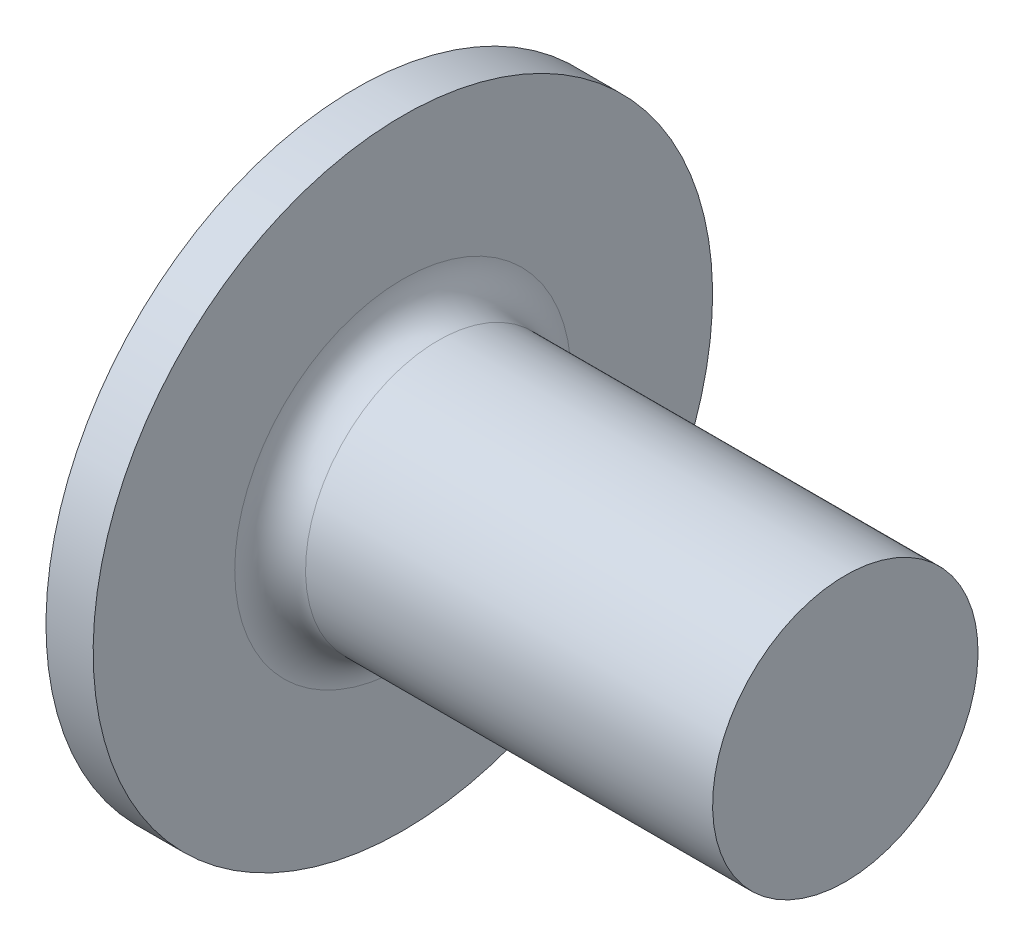
ISO-10303-21;
HEADER;
FILE_DESCRIPTION(('STEP AP214'),'2;1');
FILE_NAME('part.step','',(''),(''),'','','');
FILE_SCHEMA(('AUTOMOTIVE_DESIGN { 1 0 10303 214 1 1 1 1 }'));
ENDSEC;
DATA;
#1=APPLICATION_CONTEXT('core data for automotive mechanical design processes');
#2=APPLICATION_PROTOCOL_DEFINITION('international standard','automotive_design',2000,#1);
#3=PRODUCT_CONTEXT('',#1,'mechanical');
#4=PRODUCT('Part','Part','',(#3));
#5=PRODUCT_RELATED_PRODUCT_CATEGORY('part','',(#4));
#6=PRODUCT_DEFINITION_FORMATION('','',#4);
#7=PRODUCT_DEFINITION_CONTEXT('part definition',#1,'design');
#8=PRODUCT_DEFINITION('design','',#6,#7);
#9=PRODUCT_DEFINITION_SHAPE('','',#8);
#10=(LENGTH_UNIT() NAMED_UNIT(*) SI_UNIT(.MILLI.,.METRE.));
#11=(NAMED_UNIT(*) PLANE_ANGLE_UNIT() SI_UNIT($,.RADIAN.));
#12=(NAMED_UNIT(*) SI_UNIT($,.STERADIAN.) SOLID_ANGLE_UNIT());
#13=UNCERTAINTY_MEASURE_WITH_UNIT(LENGTH_MEASURE(1.E-05),#10,'distance_accuracy_value','');
#14=(GEOMETRIC_REPRESENTATION_CONTEXT(3) GLOBAL_UNCERTAINTY_ASSIGNED_CONTEXT((#13)) GLOBAL_UNIT_ASSIGNED_CONTEXT((#10,
#11,#12)) REPRESENTATION_CONTEXT('',''));
#15=CARTESIAN_POINT('',(0.,0.,0.));
#16=DIRECTION('',(0.,0.,1.));
#17=DIRECTION('',(1.,0.,0.));
#18=AXIS2_PLACEMENT_3D('',#15,#16,#17);
#19=CARTESIAN_POINT('',(-0.800000000000023,0.,0.));
#20=DIRECTION('',(1.,0.,0.));
#21=DIRECTION('',(0.,1.00000000000002,0.));
#22=AXIS2_PLACEMENT_3D('',#19,#20,#21);
#23=PLANE('',#22);
#24=CARTESIAN_POINT('',(-0.800000000000023,0.,0.));
#25=DIRECTION('',(-1.,0.,0.));
#26=DIRECTION('',(0.,-1.00000000000002,0.));
#27=AXIS2_PLACEMENT_3D('',#24,#25,#26);
#28=CIRCLE('',#27,3.0381197846483);
#29=CARTESIAN_POINT('',(-0.800000000000023,-3.03811978464835,0.));
#30=VERTEX_POINT('',#29);
#31=EDGE_CURVE('E212',#30,#30,#28,.T.);
#32=ORIENTED_EDGE('',*,*,#31,.T.);
#33=EDGE_LOOP('',(#32));
#34=FACE_BOUND('',#33,.T.);
#35=CARTESIAN_POINT('',(-0.800000000000023,0.824460158150964,0.476002294246936));
#36=DIRECTION('',(-1.,0.,0.));
#37=DIRECTION('',(0.,0.,-1.00000000000002));
#38=AXIS2_PLACEMENT_3D('',#35,#36,#37);
#39=CIRCLE('',#38,0.317004588484645);
#40=CARTESIAN_POINT('',(-0.800000000000023,0.744268952338256,0.169308180135719));
#41=VERTEX_POINT('',#40);
#42=CARTESIAN_POINT('',(-0.800000000000023,0.518759661231272,0.559901729910717));
#43=VERTEX_POINT('',#42);
#44=EDGE_CURVE('E51',#41,#43,#39,.T.);
#45=ORIENTED_EDGE('',*,*,#44,.T.);
#46=CARTESIAN_POINT('',(-0.800000000000023,0.350000000003403,0.606217782650686));
#47=DIRECTION('',(1.,0.,0.));
#48=DIRECTION('',(0.,0.,-1.00000000000002));
#49=AXIS2_PLACEMENT_3D('',#46,#47,#48);
#50=CIRCLE('',#49,0.174999999999998);
#51=CARTESIAN_POINT('',(-0.800000000000023,0.225509291109205,0.729209910036888));
#52=VERTEX_POINT('',#51);
#53=EDGE_CURVE('E159',#43,#52,#50,.T.);
#54=ORIENTED_EDGE('',*,*,#53,.T.);
#55=CARTESIAN_POINT('',(-0.800000000000023,5.77315972805081E-12,0.95200458848832));
#56=DIRECTION('',(-1.,0.,0.));
#57=DIRECTION('',(0.,0.,-1.00000000000002));
#58=AXIS2_PLACEMENT_3D('',#55,#56,#57);
#59=CIRCLE('',#58,0.317004588484644);
#60=CARTESIAN_POINT('',(-0.800000000000023,-0.225509291100101,0.72920991003822));
#61=VERTEX_POINT('',#60);
#62=EDGE_CURVE('E162',#52,#61,#59,.T.);
#63=ORIENTED_EDGE('',*,*,#62,.T.);
#64=CARTESIAN_POINT('',(-0.800000000000023,-0.349999999997963,0.606217782651131));
#65=DIRECTION('',(1.,0.,0.));
#66=DIRECTION('',(0.,0.,-1.00000000000002));
#67=AXIS2_PLACEMENT_3D('',#64,#65,#66);
#68=CIRCLE('',#67,0.175000000000001);
#69=CARTESIAN_POINT('',(-0.800000000000023,-0.518759661226609,0.55990172990894));
#70=VERTEX_POINT('',#69);
#71=EDGE_CURVE('E165',#61,#70,#68,.T.);
#72=ORIENTED_EDGE('',*,*,#71,.T.);
#73=CARTESIAN_POINT('',(-0.800000000000023,-0.824460158142082,0.476002294245381));
#74=DIRECTION('',(-1.,0.,0.));
#75=DIRECTION('',(0.,0.,-1.00000000000002));
#76=AXIS2_PLACEMENT_3D('',#73,#74,#75);
#77=CIRCLE('',#76,0.317004588484636);
#78=CARTESIAN_POINT('',(-0.800000000000023,-0.744268952330596,0.169308180134164));
#79=VERTEX_POINT('',#78);
#80=EDGE_CURVE('E168',#70,#79,#77,.T.);
#81=ORIENTED_EDGE('',*,*,#80,.T.);
#82=CARTESIAN_POINT('',(-0.800000000000023,-0.699999999996925,3.77475828372553E-12));
#83=DIRECTION('',(1.,0.,0.));
#84=DIRECTION('',(0.,0.,-1.00000000000002));
#85=AXIS2_PLACEMENT_3D('',#82,#83,#84);
#86=CIRCLE('',#85,0.175000000000001);
#87=CARTESIAN_POINT('',(-0.800000000000023,-0.744268952333593,-0.169308180127059));
#88=VERTEX_POINT('',#87);
#89=EDGE_CURVE('E171',#79,#88,#86,.T.);
#90=ORIENTED_EDGE('',*,*,#89,.T.);
#91=CARTESIAN_POINT('',(-0.800000000000023,-0.824460158147744,-0.476002294240718));
#92=DIRECTION('',(-1.,0.,0.));
#93=DIRECTION('',(0.,0.,-1.00000000000002));
#94=AXIS2_PLACEMENT_3D('',#91,#92,#93);
#95=CIRCLE('',#94,0.317004588484645);
#96=CARTESIAN_POINT('',(-0.800000000000023,-0.518759661227275,-0.559901729900725));
#97=VERTEX_POINT('',#96);
#98=EDGE_CURVE('E174',#88,#97,#95,.T.);
#99=ORIENTED_EDGE('',*,*,#98,.T.);
#100=CARTESIAN_POINT('',(-0.800000000000023,-0.34999999999763,-0.606217782645357));
#101=DIRECTION('',(1.,0.,0.));
#102=DIRECTION('',(0.,0.,-1.00000000000002));
#103=AXIS2_PLACEMENT_3D('',#100,#101,#102);
#104=CIRCLE('',#103,0.174999999999999);
#105=CARTESIAN_POINT('',(-0.800000000000023,-0.225509291100656,-0.729209910028894));
#106=VERTEX_POINT('',#105);
#107=EDGE_CURVE('E177',#97,#106,#104,.T.);
#108=ORIENTED_EDGE('',*,*,#107,.T.);
#109=CARTESIAN_POINT('',(-0.800000000000023,5.77315972805081E-12,-0.952004588477884));
#110=DIRECTION('',(-1.,0.,0.));
#111=DIRECTION('',(0.,0.,-1.00000000000002));
#112=AXIS2_PLACEMENT_3D('',#109,#110,#111);
#113=CIRCLE('',#112,0.317004588484644);
#114=CARTESIAN_POINT('',(-0.800000000000023,0.225509291108761,-0.729209910032003));
#115=VERTEX_POINT('',#114);
#116=EDGE_CURVE('E180',#106,#115,#113,.T.);
#117=ORIENTED_EDGE('',*,*,#116,.T.);
#118=CARTESIAN_POINT('',(-0.800000000000023,0.350000000003514,-0.606217782645357));
#119=DIRECTION('',(1.,0.,0.));
#120=DIRECTION('',(0.,0.,-1.00000000000002));
#121=AXIS2_PLACEMENT_3D('',#118,#119,#120);
#122=CIRCLE('',#121,0.175);
#123=CARTESIAN_POINT('',(-0.800000000000023,0.518759661232715,-0.559901729900059));
#124=VERTEX_POINT('',#123);
#125=EDGE_CURVE('E183',#115,#124,#122,.T.);
#126=ORIENTED_EDGE('',*,*,#125,.T.);
#127=CARTESIAN_POINT('',(-0.800000000000023,0.824460158149742,-0.476002294238054));
#128=DIRECTION('',(-1.,0.,0.));
#129=DIRECTION('',(0.,0.,-1.00000000000002));
#130=AXIS2_PLACEMENT_3D('',#127,#128,#129);
#131=CIRCLE('',#130,0.317004588484644);
#132=CARTESIAN_POINT('',(-0.800000000000023,0.744268952334037,-0.169308180130834));
#133=VERTEX_POINT('',#132);
#134=EDGE_CURVE('E149',#124,#133,#131,.T.);
#135=ORIENTED_EDGE('',*,*,#134,.T.);
#136=CARTESIAN_POINT('',(-0.800000000000023,0.700000000002143,3.77475828372553E-12));
#137=DIRECTION('',(1.,0.,0.));
#138=DIRECTION('',(0.,0.,-1.00000000000002));
#139=AXIS2_PLACEMENT_3D('',#136,#137,#138);
#140=CIRCLE('',#139,0.175);
#141=EDGE_CURVE('E186',#133,#41,#140,.T.);
#142=ORIENTED_EDGE('',*,*,#141,.T.);
#143=EDGE_LOOP('',(#45,#54,#63,#72,#81,#90,#99,#108,#117,#126,#135,#142));
#144=FACE_BOUND('',#143,.T.);
#145=ADVANCED_FACE('F36',(#34,#144),#23,.F.);
#146=CARTESIAN_POINT('',(0.,3.5000000000025,1.99840144432528E-12));
#147=DIRECTION('',(-1.,0.,0.));
#148=DIRECTION('',(0.,-1.00000000000002,0.));
#149=AXIS2_PLACEMENT_3D('',#146,#147,#148);
#150=PLANE('',#149);
#151=CARTESIAN_POINT('',(0.,0.,0.));
#152=DIRECTION('',(-1.,0.,0.));
#153=DIRECTION('',(0.,-1.00000000000002,0.));
#154=AXIS2_PLACEMENT_3D('',#151,#152,#153);
#155=CIRCLE('',#154,1.9);
#156=CARTESIAN_POINT('',(0.,-1.90000000000003,0.));
#157=VERTEX_POINT('',#156);
#158=EDGE_CURVE('E44',#157,#157,#155,.T.);
#159=ORIENTED_EDGE('',*,*,#158,.T.);
#160=EDGE_LOOP('',(#159));
#161=FACE_BOUND('',#160,.T.);
#162=CARTESIAN_POINT('',(0.,0.,0.));
#163=DIRECTION('',(-1.,0.,0.));
#164=DIRECTION('',(0.,-1.00000000000002,0.));
#165=AXIS2_PLACEMENT_3D('',#162,#163,#164);
#166=CIRCLE('',#165,3.5);
#167=CARTESIAN_POINT('',(0.,-3.50000000000005,0.));
#168=VERTEX_POINT('',#167);
#169=EDGE_CURVE('E218',#168,#168,#166,.T.);
#170=ORIENTED_EDGE('',*,*,#169,.F.);
#171=EDGE_LOOP('',(#170));
#172=FACE_BOUND('',#171,.T.);
#173=ADVANCED_FACE('F223',(#161,#172),#150,.F.);
#174=CARTESIAN_POINT('',(-0.800000000000023,0.,0.));
#175=DIRECTION('',(-1.,0.,0.));
#176=DIRECTION('',(0.,-1.00000000000002,0.));
#177=AXIS2_PLACEMENT_3D('',#174,#175,#176);
#178=CYLINDRICAL_SURFACE('',#177,3.5);
#179=CARTESIAN_POINT('',(-0.53333333333333,0.,0.));
#180=DIRECTION('',(-1.,0.,0.));
#181=DIRECTION('',(0.,-1.00000000000002,0.));
#182=AXIS2_PLACEMENT_3D('',#179,#180,#181);
#183=CIRCLE('',#182,3.5);
#184=CARTESIAN_POINT('',(-0.53333333333333,-3.50000000000005,0.));
#185=VERTEX_POINT('',#184);
#186=EDGE_CURVE('E215',#185,#185,#183,.T.);
#187=ORIENTED_EDGE('',*,*,#186,.F.);
#188=EDGE_LOOP('',(#187));
#189=FACE_BOUND('',#188,.T.);
#190=ORIENTED_EDGE('',*,*,#169,.T.);
#191=EDGE_LOOP('',(#190));
#192=FACE_BOUND('',#191,.T.);
#193=ADVANCED_FACE('F240',(#189,#192),#178,.T.);
#194=CARTESIAN_POINT('',(-0.53333333333333,0.,0.));
#195=DIRECTION('',(1.,0.,0.));
#196=DIRECTION('',(0.,1.00000000000002,0.));
#197=AXIS2_PLACEMENT_3D('',#194,#195,#196);
#198=CONICAL_SURFACE('',#197,3.5,1.0471975511966);
#199=ORIENTED_EDGE('',*,*,#31,.F.);
#200=EDGE_LOOP('',(#199));
#201=FACE_BOUND('',#200,.T.);
#202=ORIENTED_EDGE('',*,*,#186,.T.);
#203=EDGE_LOOP('',(#202));
#204=FACE_BOUND('',#203,.T.);
#205=ADVANCED_FACE('F246',(#201,#204),#198,.T.);
#206=CARTESIAN_POINT('',(5.,1.50000000000072,4.66293670342566E-12));
#207=DIRECTION('',(-1.,0.,0.));
#208=DIRECTION('',(0.,-1.00000000000002,0.));
#209=AXIS2_PLACEMENT_3D('',#206,#207,#208);
#210=PLANE('',#209);
#211=CARTESIAN_POINT('',(5.,0.,0.));
#212=DIRECTION('',(-1.,0.,0.));
#213=DIRECTION('',(0.,-1.00000000000002,0.));
#214=AXIS2_PLACEMENT_3D('',#211,#212,#213);
#215=CIRCLE('',#214,1.5);
#216=CARTESIAN_POINT('',(5.,-1.50000000000002,0.));
#217=VERTEX_POINT('',#216);
#218=EDGE_CURVE('E209',#217,#217,#215,.T.);
#219=ORIENTED_EDGE('',*,*,#218,.F.);
#220=EDGE_LOOP('',(#219));
#221=FACE_BOUND('',#220,.T.);
#222=ADVANCED_FACE('F244',(#221),#210,.F.);
#223=CARTESIAN_POINT('',(-0.800000000000023,0.,0.));
#224=DIRECTION('',(-1.,0.,0.));
#225=DIRECTION('',(0.,-1.00000000000002,0.));
#226=AXIS2_PLACEMENT_3D('',#223,#224,#225);
#227=CYLINDRICAL_SURFACE('',#226,1.5);
#228=CARTESIAN_POINT('',(0.400000000000011,0.,0.));
#229=DIRECTION('',(-1.,0.,0.));
#230=DIRECTION('',(0.,-1.00000000000002,0.));
#231=AXIS2_PLACEMENT_3D('',#228,#229,#230);
#232=CIRCLE('',#231,1.5);
#233=CARTESIAN_POINT('',(0.400000000000011,-1.50000000000002,0.));
#234=VERTEX_POINT('',#233);
#235=EDGE_CURVE('E11',#234,#234,#232,.F.);
#236=ORIENTED_EDGE('',*,*,#235,.T.);
#237=EDGE_LOOP('',(#236));
#238=FACE_BOUND('',#237,.T.);
#239=ORIENTED_EDGE('',*,*,#218,.T.);
#240=EDGE_LOOP('',(#239));
#241=FACE_BOUND('',#240,.T.);
#242=ADVANCED_FACE('F270',(#238,#241),#227,.T.);
#243=CARTESIAN_POINT('',(-0.0499999999999945,0.824460158150964,0.476002294246936));
#244=DIRECTION('',(-1.,0.,0.));
#245=DIRECTION('',(0.,0.,1.00000000000002));
#246=AXIS2_PLACEMENT_3D('',#243,#244,#245);
#247=CYLINDRICAL_SURFACE('',#246,0.317004588484645);
#248=ORIENTED_EDGE('',*,*,#44,.F.);
#249=DIRECTION('',(-1.,0.,0.));
#250=VECTOR('',#249,1.);
#251=CARTESIAN_POINT('',(-0.0499999999999945,0.744268952338256,0.169308180135719));
#252=LINE('',#251,#250);
#253=CARTESIAN_POINT('',(-0.0499999999999945,0.744268952338256,0.169308180135719));
#254=VERTEX_POINT('',#253);
#255=EDGE_CURVE('E154',#254,#41,#252,.T.);
#256=ORIENTED_EDGE('',*,*,#255,.F.);
#257=CARTESIAN_POINT('',(-0.0499999999999945,0.824460158150964,0.476002294246936));
#258=DIRECTION('',(-1.,0.,0.));
#259=DIRECTION('',(0.,0.,-1.00000000000002));
#260=AXIS2_PLACEMENT_3D('',#257,#258,#259);
#261=CIRCLE('',#260,0.317004588484645);
#262=CARTESIAN_POINT('',(-0.0499999999999945,0.518759661231272,0.559901729910717));
#263=VERTEX_POINT('',#262);
#264=EDGE_CURVE('E189',#254,#263,#261,.T.);
#265=ORIENTED_EDGE('',*,*,#264,.T.);
#266=DIRECTION('',(-1.,0.,0.));
#267=VECTOR('',#266,1.);
#268=CARTESIAN_POINT('',(-0.0499999999999945,0.518759661231272,0.559901729910717));
#269=LINE('',#268,#267);
#270=EDGE_CURVE('E207',#263,#43,#269,.T.);
#271=ORIENTED_EDGE('',*,*,#270,.T.);
#272=EDGE_LOOP('',(#248,#256,#265,#271));
#273=FACE_BOUND('',#272,.T.);
#274=ADVANCED_FACE('F277',(#273),#247,.T.);
#275=CARTESIAN_POINT('',(-0.0499999999999945,0.350000000003403,0.606217782650686));
#276=DIRECTION('',(-1.,0.,0.));
#277=DIRECTION('',(0.,0.,1.00000000000002));
#278=AXIS2_PLACEMENT_3D('',#275,#276,#277);
#279=CYLINDRICAL_SURFACE('',#278,0.174999999999998);
#280=ORIENTED_EDGE('',*,*,#53,.F.);
#281=ORIENTED_EDGE('',*,*,#270,.F.);
#282=CARTESIAN_POINT('',(-0.0499999999999945,0.350000000003403,0.606217782650686));
#283=DIRECTION('',(1.,0.,0.));
#284=DIRECTION('',(0.,0.,-1.00000000000002));
#285=AXIS2_PLACEMENT_3D('',#282,#283,#284);
#286=CIRCLE('',#285,0.174999999999998);
#287=CARTESIAN_POINT('',(-0.0499999999999945,0.225509291109205,0.729209910036888));
#288=VERTEX_POINT('',#287);
#289=EDGE_CURVE('E108',#263,#288,#286,.T.);
#290=ORIENTED_EDGE('',*,*,#289,.T.);
#291=DIRECTION('',(-1.,0.,0.));
#292=VECTOR('',#291,1.);
#293=CARTESIAN_POINT('',(-0.0499999999999945,0.225509291109205,0.729209910036888));
#294=LINE('',#293,#292);
#295=EDGE_CURVE('E205',#288,#52,#294,.T.);
#296=ORIENTED_EDGE('',*,*,#295,.T.);
#297=EDGE_LOOP('',(#280,#281,#290,#296));
#298=FACE_BOUND('',#297,.T.);
#299=ADVANCED_FACE('F284',(#298),#279,.F.);
#300=CARTESIAN_POINT('',(-0.0499999999999945,5.77315972805081E-12,0.95200458848832));
#301=DIRECTION('',(-1.,0.,0.));
#302=DIRECTION('',(0.,0.,1.00000000000002));
#303=AXIS2_PLACEMENT_3D('',#300,#301,#302);
#304=CYLINDRICAL_SURFACE('',#303,0.317004588484644);
#305=ORIENTED_EDGE('',*,*,#62,.F.);
#306=ORIENTED_EDGE('',*,*,#295,.F.);
#307=CARTESIAN_POINT('',(-0.0499999999999945,5.77315972805081E-12,0.95200458848832));
#308=DIRECTION('',(-1.,0.,0.));
#309=DIRECTION('',(0.,0.,-1.00000000000002));
#310=AXIS2_PLACEMENT_3D('',#307,#308,#309);
#311=CIRCLE('',#310,0.317004588484644);
#312=CARTESIAN_POINT('',(-0.0499999999999945,-0.225509291100101,0.72920991003822));
#313=VERTEX_POINT('',#312);
#314=EDGE_CURVE('E445',#288,#313,#311,.T.);
#315=ORIENTED_EDGE('',*,*,#314,.T.);
#316=DIRECTION('',(-1.,0.,0.));
#317=VECTOR('',#316,1.);
#318=CARTESIAN_POINT('',(-0.0499999999999945,-0.225509291100101,0.72920991003822));
#319=LINE('',#318,#317);
#320=EDGE_CURVE('E203',#313,#61,#319,.T.);
#321=ORIENTED_EDGE('',*,*,#320,.T.);
#322=EDGE_LOOP('',(#305,#306,#315,#321));
#323=FACE_BOUND('',#322,.T.);
#324=ADVANCED_FACE('F291',(#323),#304,.T.);
#325=CARTESIAN_POINT('',(-0.0499999999999945,-0.349999999997963,0.606217782651131));
#326=DIRECTION('',(-1.,0.,0.));
#327=DIRECTION('',(0.,0.,1.00000000000002));
#328=AXIS2_PLACEMENT_3D('',#325,#326,#327);
#329=CYLINDRICAL_SURFACE('',#328,0.175000000000001);
#330=ORIENTED_EDGE('',*,*,#71,.F.);
#331=ORIENTED_EDGE('',*,*,#320,.F.);
#332=CARTESIAN_POINT('',(-0.0499999999999945,-0.349999999997963,0.606217782651131));
#333=DIRECTION('',(1.,0.,0.));
#334=DIRECTION('',(0.,0.,-1.00000000000002));
#335=AXIS2_PLACEMENT_3D('',#332,#333,#334);
#336=CIRCLE('',#335,0.175000000000001);
#337=CARTESIAN_POINT('',(-0.0499999999999945,-0.518759661226609,0.55990172990894));
#338=VERTEX_POINT('',#337);
#339=EDGE_CURVE('E443',#313,#338,#336,.T.);
#340=ORIENTED_EDGE('',*,*,#339,.T.);
#341=DIRECTION('',(-1.,0.,0.));
#342=VECTOR('',#341,1.);
#343=CARTESIAN_POINT('',(-0.0499999999999945,-0.518759661226609,0.55990172990894));
#344=LINE('',#343,#342);
#345=EDGE_CURVE('E201',#338,#70,#344,.T.);
#346=ORIENTED_EDGE('',*,*,#345,.T.);
#347=EDGE_LOOP('',(#330,#331,#340,#346));
#348=FACE_BOUND('',#347,.T.);
#349=ADVANCED_FACE('F299',(#348),#329,.F.);
#350=CARTESIAN_POINT('',(-0.0499999999999945,-0.824460158142082,0.476002294245381));
#351=DIRECTION('',(-1.,0.,0.));
#352=DIRECTION('',(0.,0.,1.00000000000002));
#353=AXIS2_PLACEMENT_3D('',#350,#351,#352);
#354=CYLINDRICAL_SURFACE('',#353,0.317004588484636);
#355=ORIENTED_EDGE('',*,*,#80,.F.);
#356=ORIENTED_EDGE('',*,*,#345,.F.);
#357=CARTESIAN_POINT('',(-0.0499999999999945,-0.824460158142082,0.476002294245381));
#358=DIRECTION('',(-1.,0.,0.));
#359=DIRECTION('',(0.,0.,-1.00000000000002));
#360=AXIS2_PLACEMENT_3D('',#357,#358,#359);
#361=CIRCLE('',#360,0.317004588484636);
#362=CARTESIAN_POINT('',(-0.0499999999999945,-0.744268952330596,0.169308180134164));
#363=VERTEX_POINT('',#362);
#364=EDGE_CURVE('E441',#338,#363,#361,.T.);
#365=ORIENTED_EDGE('',*,*,#364,.T.);
#366=DIRECTION('',(-1.,0.,0.));
#367=VECTOR('',#366,1.);
#368=CARTESIAN_POINT('',(-0.0499999999999945,-0.744268952330596,0.169308180134164));
#369=LINE('',#368,#367);
#370=EDGE_CURVE('E199',#363,#79,#369,.T.);
#371=ORIENTED_EDGE('',*,*,#370,.T.);
#372=EDGE_LOOP('',(#355,#356,#365,#371));
#373=FACE_BOUND('',#372,.T.);
#374=ADVANCED_FACE('F307',(#373),#354,.T.);
#375=CARTESIAN_POINT('',(-0.0499999999999945,-0.699999999996925,3.77475828372553E-12));
#376=DIRECTION('',(-1.,0.,0.));
#377=DIRECTION('',(0.,0.,1.00000000000002));
#378=AXIS2_PLACEMENT_3D('',#375,#376,#377);
#379=CYLINDRICAL_SURFACE('',#378,0.175000000000001);
#380=ORIENTED_EDGE('',*,*,#89,.F.);
#381=ORIENTED_EDGE('',*,*,#370,.F.);
#382=CARTESIAN_POINT('',(-0.0499999999999945,-0.699999999996925,3.77475828372553E-12));
#383=DIRECTION('',(1.,0.,0.));
#384=DIRECTION('',(0.,0.,-1.00000000000002));
#385=AXIS2_PLACEMENT_3D('',#382,#383,#384);
#386=CIRCLE('',#385,0.175000000000001);
#387=CARTESIAN_POINT('',(-0.0499999999999945,-0.744268952333593,-0.169308180127059));
#388=VERTEX_POINT('',#387);
#389=EDGE_CURVE('E439',#363,#388,#386,.T.);
#390=ORIENTED_EDGE('',*,*,#389,.T.);
#391=DIRECTION('',(-1.,0.,0.));
#392=VECTOR('',#391,1.);
#393=CARTESIAN_POINT('',(-0.0499999999999945,-0.744268952333593,-0.169308180127059));
#394=LINE('',#393,#392);
#395=EDGE_CURVE('E197',#388,#88,#394,.T.);
#396=ORIENTED_EDGE('',*,*,#395,.T.);
#397=EDGE_LOOP('',(#380,#381,#390,#396));
#398=FACE_BOUND('',#397,.T.);
#399=ADVANCED_FACE('F315',(#398),#379,.F.);
#400=CARTESIAN_POINT('',(-0.0499999999999945,-0.824460158147744,-0.476002294240718));
#401=DIRECTION('',(-1.,0.,0.));
#402=DIRECTION('',(0.,0.,1.00000000000002));
#403=AXIS2_PLACEMENT_3D('',#400,#401,#402);
#404=CYLINDRICAL_SURFACE('',#403,0.317004588484645);
#405=ORIENTED_EDGE('',*,*,#98,.F.);
#406=ORIENTED_EDGE('',*,*,#395,.F.);
#407=CARTESIAN_POINT('',(-0.0499999999999945,-0.824460158147744,-0.476002294240718));
#408=DIRECTION('',(-1.,0.,0.));
#409=DIRECTION('',(0.,0.,-1.00000000000002));
#410=AXIS2_PLACEMENT_3D('',#407,#408,#409);
#411=CIRCLE('',#410,0.317004588484645);
#412=CARTESIAN_POINT('',(-0.0499999999999945,-0.518759661227275,-0.559901729900725));
#413=VERTEX_POINT('',#412);
#414=EDGE_CURVE('E435',#388,#413,#411,.T.);
#415=ORIENTED_EDGE('',*,*,#414,.T.);
#416=DIRECTION('',(-1.,0.,0.));
#417=VECTOR('',#416,1.);
#418=CARTESIAN_POINT('',(-0.0499999999999945,-0.518759661227275,-0.559901729900725));
#419=LINE('',#418,#417);
#420=EDGE_CURVE('E195',#413,#97,#419,.T.);
#421=ORIENTED_EDGE('',*,*,#420,.T.);
#422=EDGE_LOOP('',(#405,#406,#415,#421));
#423=FACE_BOUND('',#422,.T.);
#424=ADVANCED_FACE('F323',(#423),#404,.T.);
#425=CARTESIAN_POINT('',(-0.0499999999999945,-0.34999999999763,-0.606217782645357));
#426=DIRECTION('',(-1.,0.,0.));
#427=DIRECTION('',(0.,0.,1.00000000000002));
#428=AXIS2_PLACEMENT_3D('',#425,#426,#427);
#429=CYLINDRICAL_SURFACE('',#428,0.174999999999999);
#430=ORIENTED_EDGE('',*,*,#107,.F.);
#431=ORIENTED_EDGE('',*,*,#420,.F.);
#432=CARTESIAN_POINT('',(-0.0499999999999945,-0.34999999999763,-0.606217782645357));
#433=DIRECTION('',(1.,0.,0.));
#434=DIRECTION('',(0.,0.,-1.00000000000002));
#435=AXIS2_PLACEMENT_3D('',#432,#433,#434);
#436=CIRCLE('',#435,0.174999999999999);
#437=CARTESIAN_POINT('',(-0.0499999999999945,-0.225509291100656,-0.729209910028894));
#438=VERTEX_POINT('',#437);
#439=EDGE_CURVE('E434',#413,#438,#436,.T.);
#440=ORIENTED_EDGE('',*,*,#439,.T.);
#441=DIRECTION('',(-1.,0.,0.));
#442=VECTOR('',#441,1.);
#443=CARTESIAN_POINT('',(-0.0499999999999945,-0.225509291100656,-0.729209910028894));
#444=LINE('',#443,#442);
#445=EDGE_CURVE('E193',#438,#106,#444,.T.);
#446=ORIENTED_EDGE('',*,*,#445,.T.);
#447=EDGE_LOOP('',(#430,#431,#440,#446));
#448=FACE_BOUND('',#447,.T.);
#449=ADVANCED_FACE('F331',(#448),#429,.F.);
#450=CARTESIAN_POINT('',(-0.0499999999999945,5.77315972805081E-12,-0.952004588477884));
#451=DIRECTION('',(-1.,0.,0.));
#452=DIRECTION('',(0.,0.,1.00000000000002));
#453=AXIS2_PLACEMENT_3D('',#450,#451,#452);
#454=CYLINDRICAL_SURFACE('',#453,0.317004588484644);
#455=ORIENTED_EDGE('',*,*,#116,.F.);
#456=ORIENTED_EDGE('',*,*,#445,.F.);
#457=CARTESIAN_POINT('',(-0.0499999999999945,5.77315972805081E-12,-0.952004588477884));
#458=DIRECTION('',(-1.,0.,0.));
#459=DIRECTION('',(0.,0.,-1.00000000000002));
#460=AXIS2_PLACEMENT_3D('',#457,#458,#459);
#461=CIRCLE('',#460,0.317004588484644);
#462=CARTESIAN_POINT('',(-0.0499999999999945,0.225509291108761,-0.729209910032003));
#463=VERTEX_POINT('',#462);
#464=EDGE_CURVE('E145',#438,#463,#461,.T.);
#465=ORIENTED_EDGE('',*,*,#464,.T.);
#466=DIRECTION('',(-1.,0.,0.));
#467=VECTOR('',#466,1.);
#468=CARTESIAN_POINT('',(-0.0499999999999945,0.225509291108761,-0.729209910032003));
#469=LINE('',#468,#467);
#470=EDGE_CURVE('E141',#463,#115,#469,.T.);
#471=ORIENTED_EDGE('',*,*,#470,.T.);
#472=EDGE_LOOP('',(#455,#456,#465,#471));
#473=FACE_BOUND('',#472,.T.);
#474=ADVANCED_FACE('F339',(#473),#454,.T.);
#475=CARTESIAN_POINT('',(-0.0499999999999945,0.350000000003625,-0.606217782645135));
#476=DIRECTION('',(-1.,0.,0.));
#477=DIRECTION('',(0.,0.,1.00000000000002));
#478=AXIS2_PLACEMENT_3D('',#475,#476,#477);
#479=CYLINDRICAL_SURFACE('',#478,0.175);
#480=ORIENTED_EDGE('',*,*,#125,.F.);
#481=ORIENTED_EDGE('',*,*,#470,.F.);
#482=CARTESIAN_POINT('',(-0.0499999999999945,0.350000000003625,-0.606217782645135));
#483=DIRECTION('',(1.,0.,0.));
#484=DIRECTION('',(0.,0.,-1.00000000000002));
#485=AXIS2_PLACEMENT_3D('',#482,#483,#484);
#486=CIRCLE('',#485,0.175);
#487=CARTESIAN_POINT('',(-0.0499999999999945,0.518759661232715,-0.559901729900059));
#488=VERTEX_POINT('',#487);
#489=EDGE_CURVE('E136',#463,#488,#486,.T.);
#490=ORIENTED_EDGE('',*,*,#489,.T.);
#491=DIRECTION('',(-1.,0.,0.));
#492=VECTOR('',#491,1.);
#493=CARTESIAN_POINT('',(-0.0499999999999945,0.518759661232715,-0.559901729900059));
#494=LINE('',#493,#492);
#495=EDGE_CURVE('E140',#488,#124,#494,.T.);
#496=ORIENTED_EDGE('',*,*,#495,.T.);
#497=EDGE_LOOP('',(#480,#481,#490,#496));
#498=FACE_BOUND('',#497,.T.);
#499=ADVANCED_FACE('F139',(#498),#479,.F.);
#500=CARTESIAN_POINT('',(-0.0499999999999945,0.824460158149742,-0.476002294238054));
#501=DIRECTION('',(-1.,0.,0.));
#502=DIRECTION('',(0.,0.,1.00000000000002));
#503=AXIS2_PLACEMENT_3D('',#500,#501,#502);
#504=CYLINDRICAL_SURFACE('',#503,0.317004588484644);
#505=ORIENTED_EDGE('',*,*,#134,.F.);
#506=ORIENTED_EDGE('',*,*,#495,.F.);
#507=CARTESIAN_POINT('',(-0.0499999999999945,0.824460158149742,-0.476002294238054));
#508=DIRECTION('',(-1.,0.,0.));
#509=DIRECTION('',(0.,0.,-1.00000000000002));
#510=AXIS2_PLACEMENT_3D('',#507,#508,#509);
#511=CIRCLE('',#510,0.317004588484644);
#512=CARTESIAN_POINT('',(-0.0499999999999945,0.744268952334037,-0.169308180130834));
#513=VERTEX_POINT('',#512);
#514=EDGE_CURVE('E144',#488,#513,#511,.T.);
#515=ORIENTED_EDGE('',*,*,#514,.T.);
#516=DIRECTION('',(-1.,0.,0.));
#517=VECTOR('',#516,1.);
#518=CARTESIAN_POINT('',(-0.0499999999999945,0.744268952334037,-0.169308180130834));
#519=LINE('',#518,#517);
#520=EDGE_CURVE('E99',#513,#133,#519,.T.);
#521=ORIENTED_EDGE('',*,*,#520,.T.);
#522=EDGE_LOOP('',(#505,#506,#515,#521));
#523=FACE_BOUND('',#522,.T.);
#524=ADVANCED_FACE('F147',(#523),#504,.T.);
#525=CARTESIAN_POINT('',(-0.0499999999999945,0.700000000002365,2.44249065417534E-12));
#526=DIRECTION('',(-1.,0.,0.));
#527=DIRECTION('',(0.,0.,1.00000000000002));
#528=AXIS2_PLACEMENT_3D('',#525,#526,#527);
#529=CYLINDRICAL_SURFACE('',#528,0.175);
#530=ORIENTED_EDGE('',*,*,#141,.F.);
#531=ORIENTED_EDGE('',*,*,#520,.F.);
#532=CARTESIAN_POINT('',(-0.0499999999999945,0.700000000002365,2.44249065417534E-12));
#533=DIRECTION('',(1.,0.,0.));
#534=DIRECTION('',(0.,0.,-1.00000000000002));
#535=AXIS2_PLACEMENT_3D('',#532,#533,#534);
#536=CIRCLE('',#535,0.175);
#537=EDGE_CURVE('E59',#513,#254,#536,.T.);
#538=ORIENTED_EDGE('',*,*,#537,.T.);
#539=ORIENTED_EDGE('',*,*,#255,.T.);
#540=EDGE_LOOP('',(#530,#531,#538,#539));
#541=FACE_BOUND('',#540,.T.);
#542=ADVANCED_FACE('F231',(#541),#529,.F.);
#543=CARTESIAN_POINT('',(-0.0499999999999945,0.762230079074167,0.238001147125688));
#544=DIRECTION('',(1.,0.,0.));
#545=DIRECTION('',(0.,0.,-1.00000000000002));
#546=AXIS2_PLACEMENT_3D('',#543,#544,#545);
#547=PLANE('',#546);
#548=ORIENTED_EDGE('',*,*,#264,.F.);
#549=ORIENTED_EDGE('',*,*,#537,.F.);
#550=ORIENTED_EDGE('',*,*,#514,.F.);
#551=ORIENTED_EDGE('',*,*,#489,.F.);
#552=ORIENTED_EDGE('',*,*,#464,.F.);
#553=ORIENTED_EDGE('',*,*,#439,.F.);
#554=ORIENTED_EDGE('',*,*,#414,.F.);
#555=ORIENTED_EDGE('',*,*,#389,.F.);
#556=ORIENTED_EDGE('',*,*,#364,.F.);
#557=ORIENTED_EDGE('',*,*,#339,.F.);
#558=ORIENTED_EDGE('',*,*,#314,.F.);
#559=ORIENTED_EDGE('',*,*,#289,.F.);
#560=EDGE_LOOP('',(#548,#549,#550,#551,#552,#553,#554,#555,#556,#557,#558,#559));
#561=FACE_BOUND('',#560,.T.);
#562=ADVANCED_FACE('F152',(#561),#547,.F.);
#563=CARTESIAN_POINT('',(0.400000000000011,0.,0.));
#564=DIRECTION('',(-1.,0.,0.));
#565=DIRECTION('',(0.,-1.00000000000002,0.));
#566=AXIS2_PLACEMENT_3D('',#563,#564,#565);
#567=TOROIDAL_SURFACE('',#566,1.9,0.4);
#568=ORIENTED_EDGE('',*,*,#235,.F.);
#569=EDGE_LOOP('',(#568));
#570=FACE_BOUND('',#569,.T.);
#571=ORIENTED_EDGE('',*,*,#158,.F.);
#572=EDGE_LOOP('',(#571));
#573=FACE_BOUND('',#572,.T.);
#574=ADVANCED_FACE('F38',(#570,#573),#567,.F.);
#575=CLOSED_SHELL('',(#145,#173,#193,#205,#222,#242,#274,#299,#324,#349,#374,#399,#424,#449,
#474,#499,#524,#542,#562,#574));
#576=MANIFOLD_SOLID_BREP('B2',#575);
#577=ADVANCED_BREP_SHAPE_REPRESENTATION('',(#18,#576),#14);
#578=SHAPE_DEFINITION_REPRESENTATION(#9,#577);
ENDSEC;
END-ISO-10303-21;
